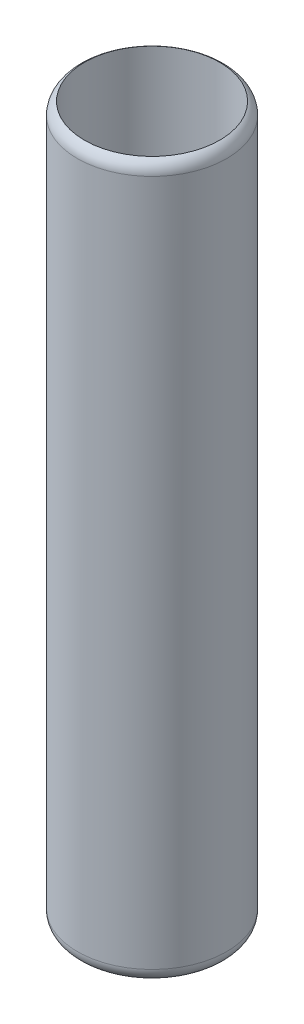
ISO-10303-21;
HEADER;
FILE_DESCRIPTION(('STEP AP214'),'2;1');
FILE_NAME('part.step','',(''),(''),'','','');
FILE_SCHEMA(('AUTOMOTIVE_DESIGN { 1 0 10303 214 1 1 1 1 }'));
ENDSEC;
DATA;
#1=APPLICATION_CONTEXT('core data for automotive mechanical design processes');
#2=APPLICATION_PROTOCOL_DEFINITION('international standard','automotive_design',2000,#1);
#3=PRODUCT_CONTEXT('',#1,'mechanical');
#4=PRODUCT('Part','Part','',(#3));
#5=PRODUCT_RELATED_PRODUCT_CATEGORY('part','',(#4));
#6=PRODUCT_DEFINITION_FORMATION('','',#4);
#7=PRODUCT_DEFINITION_CONTEXT('part definition',#1,'design');
#8=PRODUCT_DEFINITION('design','',#6,#7);
#9=PRODUCT_DEFINITION_SHAPE('','',#8);
#10=(LENGTH_UNIT() NAMED_UNIT(*) SI_UNIT(.MILLI.,.METRE.));
#11=(NAMED_UNIT(*) PLANE_ANGLE_UNIT() SI_UNIT($,.RADIAN.));
#12=(NAMED_UNIT(*) SI_UNIT($,.STERADIAN.) SOLID_ANGLE_UNIT());
#13=UNCERTAINTY_MEASURE_WITH_UNIT(LENGTH_MEASURE(1.E-05),#10,'distance_accuracy_value','');
#14=(GEOMETRIC_REPRESENTATION_CONTEXT(3) GLOBAL_UNCERTAINTY_ASSIGNED_CONTEXT((#13)) GLOBAL_UNIT_ASSIGNED_CONTEXT((#10,
#11,#12)) REPRESENTATION_CONTEXT('',''));
#15=CARTESIAN_POINT('',(0.,0.,0.));
#16=DIRECTION('',(0.,0.,1.));
#17=DIRECTION('',(1.,0.,0.));
#18=AXIS2_PLACEMENT_3D('',#15,#16,#17);
#19=CARTESIAN_POINT('',(0.,50.,0.));
#20=DIRECTION('',(0.,-1.,0.));
#21=DIRECTION('',(0.,0.,-1.));
#22=AXIS2_PLACEMENT_3D('',#19,#20,#21);
#23=CYLINDRICAL_SURFACE('',#22,5.25);
#24=CARTESIAN_POINT('',(0.,0.866025403784443,0.));
#25=DIRECTION('',(0.,-1.,0.));
#26=DIRECTION('',(0.,0.,-1.));
#27=AXIS2_PLACEMENT_3D('',#24,#25,#26);
#28=CIRCLE('',#27,5.25);
#29=CARTESIAN_POINT('',(0.,0.866025403784443,-5.25));
#30=VERTEX_POINT('',#29);
#31=EDGE_CURVE('E10',#30,#30,#28,.F.);
#32=ORIENTED_EDGE('',*,*,#31,.T.);
#33=EDGE_LOOP('',(#32));
#34=FACE_BOUND('',#33,.T.);
#35=CARTESIAN_POINT('',(0.,49.1339745962156,0.));
#36=DIRECTION('',(0.,1.,0.));
#37=DIRECTION('',(0.,0.,1.));
#38=AXIS2_PLACEMENT_3D('',#35,#36,#37);
#39=CIRCLE('',#38,5.25);
#40=CARTESIAN_POINT('',(0.,49.1339745962156,5.25));
#41=VERTEX_POINT('',#40);
#42=EDGE_CURVE('E38',#41,#41,#39,.F.);
#43=ORIENTED_EDGE('',*,*,#42,.T.);
#44=EDGE_LOOP('',(#43));
#45=FACE_BOUND('',#44,.T.);
#46=ADVANCED_FACE('F31',(#34,#45),#23,.T.);
#47=CARTESIAN_POINT('',(0.,0.,0.));
#48=DIRECTION('',(0.,1.,0.));
#49=DIRECTION('',(0.,0.,1.));
#50=AXIS2_PLACEMENT_3D('',#47,#48,#49);
#51=CYLINDRICAL_SURFACE('',#50,4.75);
#52=CARTESIAN_POINT('',(0.,0.,0.));
#53=DIRECTION('',(0.,1.,0.));
#54=DIRECTION('',(0.,0.,1.));
#55=AXIS2_PLACEMENT_3D('',#52,#53,#54);
#56=CIRCLE('',#55,4.75);
#57=CARTESIAN_POINT('',(0.,0.,4.75));
#58=VERTEX_POINT('',#57);
#59=EDGE_CURVE('E42',#58,#58,#56,.T.);
#60=ORIENTED_EDGE('',*,*,#59,.F.);
#61=EDGE_LOOP('',(#60));
#62=FACE_BOUND('',#61,.T.);
#63=CARTESIAN_POINT('',(0.,50.,0.));
#64=DIRECTION('',(0.,1.,0.));
#65=DIRECTION('',(0.,0.,1.));
#66=AXIS2_PLACEMENT_3D('',#63,#64,#65);
#67=CIRCLE('',#66,4.75);
#68=CARTESIAN_POINT('',(0.,50.,4.75));
#69=VERTEX_POINT('',#68);
#70=EDGE_CURVE('E46',#69,#69,#67,.T.);
#71=ORIENTED_EDGE('',*,*,#70,.T.);
#72=EDGE_LOOP('',(#71));
#73=FACE_BOUND('',#72,.T.);
#74=ADVANCED_FACE('F52',(#62,#73),#51,.F.);
#75=CARTESIAN_POINT('',(0.,0.866025403784439,0.));
#76=DIRECTION('',(0.,-1.,0.));
#77=DIRECTION('',(0.,0.,-1.));
#78=AXIS2_PLACEMENT_3D('',#75,#76,#77);
#79=TOROIDAL_SURFACE('',#78,4.25,1.);
#80=ORIENTED_EDGE('',*,*,#59,.T.);
#81=EDGE_LOOP('',(#80));
#82=FACE_BOUND('',#81,.T.);
#83=ORIENTED_EDGE('',*,*,#31,.F.);
#84=EDGE_LOOP('',(#83));
#85=FACE_BOUND('',#84,.T.);
#86=ADVANCED_FACE('F55',(#82,#85),#79,.T.);
#87=CARTESIAN_POINT('',(0.,49.1339745962156,0.));
#88=DIRECTION('',(0.,1.,0.));
#89=DIRECTION('',(0.,0.,1.));
#90=AXIS2_PLACEMENT_3D('',#87,#88,#89);
#91=TOROIDAL_SURFACE('',#90,4.25,1.);
#92=ORIENTED_EDGE('',*,*,#42,.F.);
#93=EDGE_LOOP('',(#92));
#94=FACE_BOUND('',#93,.T.);
#95=ORIENTED_EDGE('',*,*,#70,.F.);
#96=EDGE_LOOP('',(#95));
#97=FACE_BOUND('',#96,.T.);
#98=ADVANCED_FACE('F33',(#94,#97),#91,.T.);
#99=CLOSED_SHELL('',(#46,#74,#86,#98));
#100=MANIFOLD_SOLID_BREP('B2',#99);
#101=ADVANCED_BREP_SHAPE_REPRESENTATION('',(#18,#100),#14);
#102=SHAPE_DEFINITION_REPRESENTATION(#9,#101);
ENDSEC;
END-ISO-10303-21;
